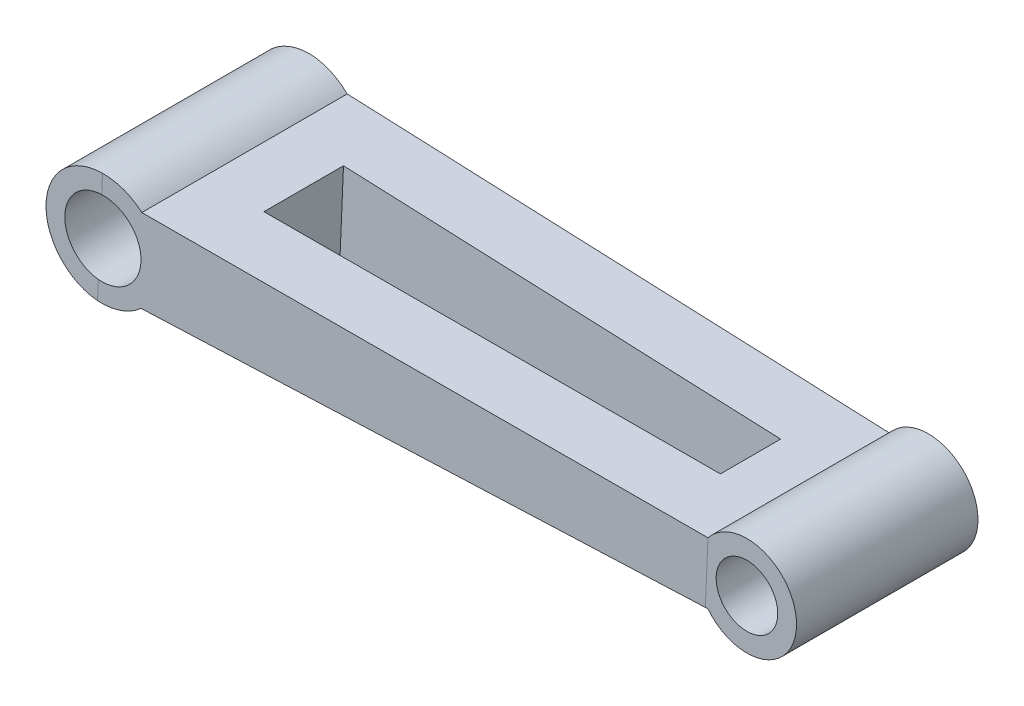
ISO-10303-21;
HEADER;
FILE_DESCRIPTION(('STEP AP214'),'2;1');
FILE_NAME('part.step','',(''),(''),'','','');
FILE_SCHEMA(('AUTOMOTIVE_DESIGN { 1 0 10303 214 1 1 1 1 }'));
ENDSEC;
DATA;
#1=APPLICATION_CONTEXT('core data for automotive mechanical design processes');
#2=APPLICATION_PROTOCOL_DEFINITION('international standard','automotive_design',2000,#1);
#3=PRODUCT_CONTEXT('',#1,'mechanical');
#4=PRODUCT('Part','Part','',(#3));
#5=PRODUCT_RELATED_PRODUCT_CATEGORY('part','',(#4));
#6=PRODUCT_DEFINITION_FORMATION('','',#4);
#7=PRODUCT_DEFINITION_CONTEXT('part definition',#1,'design');
#8=PRODUCT_DEFINITION('design','',#6,#7);
#9=PRODUCT_DEFINITION_SHAPE('','',#8);
#10=(LENGTH_UNIT() NAMED_UNIT(*) SI_UNIT(.MILLI.,.METRE.));
#11=(NAMED_UNIT(*) PLANE_ANGLE_UNIT() SI_UNIT($,.RADIAN.));
#12=(NAMED_UNIT(*) SI_UNIT($,.STERADIAN.) SOLID_ANGLE_UNIT());
#13=UNCERTAINTY_MEASURE_WITH_UNIT(LENGTH_MEASURE(1.E-05),#10,'distance_accuracy_value','');
#14=(GEOMETRIC_REPRESENTATION_CONTEXT(3) GLOBAL_UNCERTAINTY_ASSIGNED_CONTEXT((#13)) GLOBAL_UNIT_ASSIGNED_CONTEXT((#10,
#11,#12)) REPRESENTATION_CONTEXT('',''));
#15=CARTESIAN_POINT('',(0.,0.,0.));
#16=DIRECTION('',(0.,0.,1.));
#17=DIRECTION('',(1.,0.,0.));
#18=AXIS2_PLACEMENT_3D('',#15,#16,#17);
#19=CARTESIAN_POINT('',(184.500000000001,1.71965175207314E-11,121.));
#20=DIRECTION('',(0.,0.,-1.));
#21=DIRECTION('',(-1.,0.,0.));
#22=AXIS2_PLACEMENT_3D('',#19,#20,#21);
#23=CYLINDRICAL_SURFACE('',#22,29.);
#24=DIRECTION('',(0.,0.,-1.));
#25=VECTOR('',#24,1.);
#26=CARTESIAN_POINT('',(161.762365998198,-17.9999999999839,121.));
#27=LINE('',#26,#25);
#28=CARTESIAN_POINT('',(161.762365998198,-17.9999999999839,113.5));
#29=VERTEX_POINT('',#28);
#30=CARTESIAN_POINT('',(161.762365998198,-17.9999999999839,7.50000000000001));
#31=VERTEX_POINT('',#30);
#32=EDGE_CURVE('E213',#29,#31,#27,.T.);
#33=ORIENTED_EDGE('',*,*,#32,.T.);
#34=CARTESIAN_POINT('',(184.500000000001,1.71965175207314E-11,7.50000000000001));
#35=DIRECTION('',(0.,0.,1.));
#36=DIRECTION('',(1.,0.,0.));
#37=AXIS2_PLACEMENT_3D('',#34,#35,#36);
#38=CIRCLE('',#37,29.);
#39=CARTESIAN_POINT('',(161.762365998197,18.0000000000167,7.50000000000001));
#40=VERTEX_POINT('',#39);
#41=EDGE_CURVE('E233',#31,#40,#38,.T.);
#42=ORIENTED_EDGE('',*,*,#41,.T.);
#43=DIRECTION('',(0.,0.,-1.));
#44=VECTOR('',#43,1.);
#45=CARTESIAN_POINT('',(161.762365998196,18.0000000000161,121.));
#46=LINE('',#45,#44);
#47=CARTESIAN_POINT('',(161.762365998197,18.0000000000167,113.5));
#48=VERTEX_POINT('',#47);
#49=EDGE_CURVE('E206',#48,#40,#46,.T.);
#50=ORIENTED_EDGE('',*,*,#49,.F.);
#51=CARTESIAN_POINT('',(184.500000000001,1.71965175207314E-11,113.5));
#52=DIRECTION('',(0.,0.,-1.));
#53=DIRECTION('',(-1.,0.,0.));
#54=AXIS2_PLACEMENT_3D('',#51,#52,#53);
#55=CIRCLE('',#54,29.);
#56=EDGE_CURVE('E230',#48,#29,#55,.T.);
#57=ORIENTED_EDGE('',*,*,#56,.T.);
#58=EDGE_LOOP('',(#33,#42,#50,#57));
#59=FACE_BOUND('',#58,.T.);
#60=ADVANCED_FACE('F41',(#59),#23,.T.);
#61=CARTESIAN_POINT('',(0.432959275254487,-21.2820626529773,121.));
#62=DIRECTION('',(0.0203396501141064,-0.999793127918589,0.));
#63=DIRECTION('',(0.999793127918589,0.0203396501141064,0.));
#64=AXIS2_PLACEMENT_3D('',#61,#62,#63);
#65=PLANE('',#64);
#66=DIRECTION('',(0.,0.,-1.));
#67=VECTOR('',#66,1.);
#68=CARTESIAN_POINT('',(-129.48390804461,-23.9250730432448,121.));
#69=LINE('',#68,#67);
#70=CARTESIAN_POINT('',(-129.48390804461,-23.9250730432448,83.7488496268489));
#71=VERTEX_POINT('',#70);
#72=CARTESIAN_POINT('',(-129.483908044609,-23.9250730432447,37.2511503731511));
#73=VERTEX_POINT('',#72);
#74=EDGE_CURVE('E155',#71,#73,#69,.T.);
#75=ORIENTED_EDGE('',*,*,#74,.F.);
#76=DIRECTION('',(0.99956006873134,0.0203349087909345,-0.0215907499235799));
#77=VECTOR('',#76,1.);
#78=CARTESIAN_POINT('',(-0.43152927830131,-21.2996496859504,80.961285653307));
#79=LINE('',#78,#77);
#80=CARTESIAN_POINT('',(131.991309330689,-18.6056581698945,78.1009188959534));
#81=VERTEX_POINT('',#80);
#82=EDGE_CURVE('E153',#71,#81,#79,.T.);
#83=ORIENTED_EDGE('',*,*,#82,.T.);
#84=DIRECTION('',(0.,0.,-1.));
#85=VECTOR('',#84,1.);
#86=CARTESIAN_POINT('',(131.991309330689,-18.6056581698945,121.));
#87=LINE('',#86,#85);
#88=CARTESIAN_POINT('',(131.991309330689,-18.6056581698945,42.8990811040466));
#89=VERTEX_POINT('',#88);
#90=EDGE_CURVE('E138',#81,#89,#87,.T.);
#91=ORIENTED_EDGE('',*,*,#90,.T.);
#92=DIRECTION('',(0.99956006873134,0.0203349087909345,0.0215907499235799));
#93=VECTOR('',#92,1.);
#94=CARTESIAN_POINT('',(2.17980215048523,-21.2465251283691,40.0951197650467));
#95=LINE('',#94,#93);
#96=EDGE_CURVE('E133',#73,#89,#95,.T.);
#97=ORIENTED_EDGE('',*,*,#96,.F.);
#98=EDGE_LOOP('',(#75,#83,#91,#97));
#99=FACE_BOUND('',#98,.T.);
#100=DIRECTION('',(-0.999793127918589,-0.0203396501141064,0.));
#101=VECTOR('',#100,1.);
#102=CARTESIAN_POINT('',(0.432959275254487,-21.2820626529773,7.50000000000001));
#103=LINE('',#102,#101);
#104=CARTESIAN_POINT('',(160.201479312419,-18.0317544581513,7.5));
#105=VERTEX_POINT('',#104);
#106=EDGE_CURVE('E193',#31,#105,#103,.T.);
#107=ORIENTED_EDGE('',*,*,#106,.F.);
#108=ORIENTED_EDGE('',*,*,#32,.F.);
#109=DIRECTION('',(0.999793127918589,0.0203396501141064,0.));
#110=VECTOR('',#109,1.);
#111=CARTESIAN_POINT('',(0.432959275254487,-21.2820626529773,113.5));
#112=LINE('',#111,#110);
#113=CARTESIAN_POINT('',(160.201479312419,-18.0317544581513,113.5));
#114=VERTEX_POINT('',#113);
#115=EDGE_CURVE('E188',#114,#29,#112,.T.);
#116=ORIENTED_EDGE('',*,*,#115,.F.);
#117=DIRECTION('',(-0.99956006873134,-0.0203349087909345,0.0215907499235799));
#118=VECTOR('',#117,1.);
#119=CARTESIAN_POINT('',(0.345577659523577,-21.2838403322199,116.952927847325));
#120=LINE('',#119,#118);
#121=CARTESIAN_POINT('',(-162.5,-24.5967477524977,120.470433451435));
#122=VERTEX_POINT('',#121);
#123=EDGE_CURVE('E180',#114,#122,#120,.T.);
#124=ORIENTED_EDGE('',*,*,#123,.T.);
#125=DIRECTION('',(0.,0.,-1.));
#126=VECTOR('',#125,1.);
#127=CARTESIAN_POINT('',(-162.5,-24.5967477524977,121.));
#128=LINE('',#127,#126);
#129=CARTESIAN_POINT('',(-162.5,-24.5967477524977,0.529566548564874));
#130=VERTEX_POINT('',#129);
#131=EDGE_CURVE('E216',#122,#130,#128,.T.);
#132=ORIENTED_EDGE('',*,*,#131,.T.);
#133=DIRECTION('',(-0.99956006873134,-0.0203349087909345,-0.0215907499235799));
#134=VECTOR('',#133,1.);
#135=CARTESIAN_POINT('',(2.95690908831012,-21.2307157746386,4.10347757102926));
#136=LINE('',#135,#134);
#137=EDGE_CURVE('E168',#105,#130,#136,.T.);
#138=ORIENTED_EDGE('',*,*,#137,.F.);
#139=EDGE_LOOP('',(#107,#108,#116,#124,#132,#138));
#140=FACE_BOUND('',#139,.T.);
#141=ADVANCED_FACE('F151',(#99,#140),#65,.T.);
#142=CARTESIAN_POINT('',(0.,0.,121.));
#143=DIRECTION('',(0.,0.,1.));
#144=DIRECTION('',(1.,0.,0.));
#145=AXIS2_PLACEMENT_3D('',#142,#143,#144);
#146=PLANE('',#145);
#147=CARTESIAN_POINT('',(-184.5,0.,121.));
#148=DIRECTION('',(0.,0.,1.));
#149=DIRECTION('',(1.,0.,0.));
#150=AXIS2_PLACEMENT_3D('',#147,#148,#149);
#151=CIRCLE('',#150,33.);
#152=CARTESIAN_POINT('',(-184.5,33.,121.));
#153=VERTEX_POINT('',#152);
#154=CARTESIAN_POINT('',(-187.353748319103,-32.8763763290788,121.));
#155=VERTEX_POINT('',#154);
#156=EDGE_CURVE('E202',#153,#155,#151,.T.);
#157=ORIENTED_EDGE('',*,*,#156,.T.);
#158=DIRECTION('',(0.0432791626888545,0.999063018070908,0.));
#159=VECTOR('',#158,1.);
#160=CARTESIAN_POINT('',(-185.581289806749,8.03933554568197,121.));
#161=LINE('',#160,#159);
#162=CARTESIAN_POINT('',(-186.877007246941,-21.8712102213844,121.));
#163=VERTEX_POINT('',#162);
#164=EDGE_CURVE('E229',#155,#163,#161,.T.);
#165=ORIENTED_EDGE('',*,*,#164,.T.);
#166=CARTESIAN_POINT('',(-184.5,0.,121.));
#167=DIRECTION('',(0.,0.,1.));
#168=DIRECTION('',(1.,0.,0.));
#169=AXIS2_PLACEMENT_3D('',#166,#167,#168);
#170=CIRCLE('',#169,22.);
#171=CARTESIAN_POINT('',(-184.976741072162,21.9948338923056,121.));
#172=VERTEX_POINT('',#171);
#173=EDGE_CURVE('E199',#172,#163,#170,.T.);
#174=ORIENTED_EDGE('',*,*,#173,.F.);
#175=EDGE_CURVE('E226',#172,#153,#161,.T.);
#176=ORIENTED_EDGE('',*,*,#175,.T.);
#177=EDGE_LOOP('',(#157,#165,#174,#176));
#178=FACE_BOUND('',#177,.T.);
#179=ADVANCED_FACE('F267',(#178),#146,.T.);
#180=CARTESIAN_POINT('',(0.,0.,0.));
#181=DIRECTION('',(0.,0.,1.));
#182=DIRECTION('',(1.,0.,0.));
#183=AXIS2_PLACEMENT_3D('',#180,#181,#182);
#184=PLANE('',#183);
#185=CARTESIAN_POINT('',(-184.5,0.,0.));
#186=DIRECTION('',(0.,0.,1.));
#187=DIRECTION('',(1.,0.,0.));
#188=AXIS2_PLACEMENT_3D('',#185,#186,#187);
#189=CIRCLE('',#188,33.);
#190=CARTESIAN_POINT('',(-184.5,33.,0.));
#191=VERTEX_POINT('',#190);
#192=CARTESIAN_POINT('',(-187.353748319104,-32.8763763290788,0.));
#193=VERTEX_POINT('',#192);
#194=EDGE_CURVE('E203',#191,#193,#189,.T.);
#195=ORIENTED_EDGE('',*,*,#194,.F.);
#196=DIRECTION('',(-0.0432791626888545,-0.999063018070908,0.));
#197=VECTOR('',#196,1.);
#198=CARTESIAN_POINT('',(-185.581289806749,8.03933554568198,0.));
#199=LINE('',#198,#197);
#200=CARTESIAN_POINT('',(-184.976741072162,21.9948338923056,0.));
#201=VERTEX_POINT('',#200);
#202=EDGE_CURVE('E225',#191,#201,#199,.T.);
#203=ORIENTED_EDGE('',*,*,#202,.T.);
#204=CARTESIAN_POINT('',(-184.5,0.,0.));
#205=DIRECTION('',(0.,0.,1.));
#206=DIRECTION('',(1.,0.,0.));
#207=AXIS2_PLACEMENT_3D('',#204,#205,#206);
#208=CIRCLE('',#207,22.);
#209=CARTESIAN_POINT('',(-186.877007246941,-21.8712102213844,0.));
#210=VERTEX_POINT('',#209);
#211=EDGE_CURVE('E198',#201,#210,#208,.T.);
#212=ORIENTED_EDGE('',*,*,#211,.T.);
#213=EDGE_CURVE('E222',#210,#193,#199,.T.);
#214=ORIENTED_EDGE('',*,*,#213,.T.);
#215=EDGE_LOOP('',(#195,#203,#212,#214));
#216=FACE_BOUND('',#215,.T.);
#217=ADVANCED_FACE('F270',(#216),#184,.F.);
#218=CARTESIAN_POINT('',(-184.5,0.,121.));
#219=DIRECTION('',(0.,0.,-1.));
#220=DIRECTION('',(-1.,0.,0.));
#221=AXIS2_PLACEMENT_3D('',#218,#219,#220);
#222=CYLINDRICAL_SURFACE('',#221,22.);
#223=CARTESIAN_POINT('',(-184.5,0.,0.0309059177303062));
#224=DIRECTION('',(-0.0216142453727142,0.000936323760325724,0.999765946456861));
#225=DIRECTION('',(-0.99882918383171,0.0432690330474831,-0.0216345165237416));
#226=AXIS2_PLACEMENT_3D('',#223,#224,#225);
#227=ELLIPSE('',#226,22.0051503834146,22.);
#228=EDGE_CURVE('E164',#210,#201,#227,.T.);
#229=ORIENTED_EDGE('',*,*,#228,.F.);
#230=ORIENTED_EDGE('',*,*,#211,.F.);
#231=EDGE_LOOP('',(#229,#230));
#232=FACE_BOUND('',#231,.T.);
#233=ORIENTED_EDGE('',*,*,#173,.T.);
#234=CARTESIAN_POINT('',(-184.5,0.,120.96909408227));
#235=DIRECTION('',(0.0216142453727142,-0.000936323760325724,0.999765946456861));
#236=DIRECTION('',(0.99882918383171,-0.0432690330474831,-0.0216345165237416));
#237=AXIS2_PLACEMENT_3D('',#234,#235,#236);
#238=ELLIPSE('',#237,22.0051503834146,22.);
#239=EDGE_CURVE('E177',#163,#172,#238,.T.);
#240=ORIENTED_EDGE('',*,*,#239,.T.);
#241=EDGE_LOOP('',(#233,#240));
#242=FACE_BOUND('',#241,.T.);
#243=ADVANCED_FACE('F43',(#232,#242),#222,.F.);
#244=CARTESIAN_POINT('',(-184.5,0.,121.));
#245=DIRECTION('',(0.,0.,-1.));
#246=DIRECTION('',(-1.,0.,0.));
#247=AXIS2_PLACEMENT_3D('',#244,#245,#246);
#248=CYLINDRICAL_SURFACE('',#247,33.);
#249=ORIENTED_EDGE('',*,*,#194,.T.);
#250=CARTESIAN_POINT('',(-184.5,0.,0.0309059177303062));
#251=DIRECTION('',(-0.0216142453727142,0.000936323760325724,0.999765946456861));
#252=DIRECTION('',(-0.99882918383171,0.0432690330474831,-0.0216345165237416));
#253=AXIS2_PLACEMENT_3D('',#250,#251,#252);
#254=ELLIPSE('',#253,33.0077255751218,33.);
#255=EDGE_CURVE('E170',#193,#130,#254,.T.);
#256=ORIENTED_EDGE('',*,*,#255,.T.);
#257=ORIENTED_EDGE('',*,*,#131,.F.);
#258=CARTESIAN_POINT('',(-184.5,0.,120.96909408227));
#259=DIRECTION('',(0.0216142453727142,-0.000936323760325724,0.999765946456861));
#260=DIRECTION('',(0.99882918383171,-0.0432690330474831,-0.0216345165237416));
#261=AXIS2_PLACEMENT_3D('',#258,#259,#260);
#262=ELLIPSE('',#261,33.0077255751218,33.);
#263=EDGE_CURVE('E183',#155,#122,#262,.T.);
#264=ORIENTED_EDGE('',*,*,#263,.F.);
#265=ORIENTED_EDGE('',*,*,#156,.F.);
#266=CARTESIAN_POINT('',(-162.025328376794,24.1637980340231,120.505837726582));
#267=VERTEX_POINT('',#266);
#268=EDGE_CURVE('E185',#267,#153,#262,.T.);
#269=ORIENTED_EDGE('',*,*,#268,.F.);
#270=DIRECTION('',(0.,0.,-1.));
#271=VECTOR('',#270,1.);
#272=CARTESIAN_POINT('',(-162.025328376794,24.1637980340231,121.));
#273=LINE('',#272,#271);
#274=CARTESIAN_POINT('',(-162.025328376794,24.1637980340231,0.494162273417906));
#275=VERTEX_POINT('',#274);
#276=EDGE_CURVE('E219',#267,#275,#273,.T.);
#277=ORIENTED_EDGE('',*,*,#276,.T.);
#278=EDGE_CURVE('E173',#275,#191,#254,.T.);
#279=ORIENTED_EDGE('',*,*,#278,.T.);
#280=EDGE_LOOP('',(#249,#256,#257,#264,#265,#269,#277,#279));
#281=FACE_BOUND('',#280,.T.);
#282=ADVANCED_FACE('F273',(#281),#248,.T.);
#283=CARTESIAN_POINT('',(0.40113344130945,21.0717598762491,121.));
#284=DIRECTION('',(-0.0190330935837219,-0.999818854267428,0.));
#285=DIRECTION('',(0.999818854267428,-0.0190330935837219,0.));
#286=AXIS2_PLACEMENT_3D('',#283,#284,#285);
#287=PLANE('',#286);
#288=DIRECTION('',(0.999584980755785,-0.0190286414408014,-0.0216281541601559));
#289=VECTOR('',#288,1.);
#290=CARTESIAN_POINT('',(-0.464001926839432,21.0882290619964,81.0016857589098));
#291=LINE('',#290,#289);
#292=CARTESIAN_POINT('',(-127.429240001834,23.505208145604,83.7488496268489));
#293=VERTEX_POINT('',#292);
#294=CARTESIAN_POINT('',(133.600281479603,18.5361087039751,78.1009188959534));
#295=VERTEX_POINT('',#294);
#296=EDGE_CURVE('E49',#293,#295,#291,.T.);
#297=ORIENTED_EDGE('',*,*,#296,.F.);
#298=DIRECTION('',(0.,0.,-1.));
#299=VECTOR('',#298,1.);
#300=CARTESIAN_POINT('',(-127.429240001833,23.505208145604,121.));
#301=LINE('',#300,#299);
#302=CARTESIAN_POINT('',(-127.429240001834,23.505208145604,37.2511503731511));
#303=VERTEX_POINT('',#302);
#304=EDGE_CURVE('E11',#293,#303,#301,.T.);
#305=ORIENTED_EDGE('',*,*,#304,.T.);
#306=DIRECTION('',(0.999584980755785,-0.0190286414408014,0.0216281541601558));
#307=VECTOR('',#306,1.);
#308=CARTESIAN_POINT('',(2.15191861841603,21.038430980741,40.0549152644276));
#309=LINE('',#308,#307);
#310=CARTESIAN_POINT('',(133.600281479603,18.536108703975,42.8990811040466));
#311=VERTEX_POINT('',#310);
#312=EDGE_CURVE('E236',#303,#311,#309,.T.);
#313=ORIENTED_EDGE('',*,*,#312,.T.);
#314=DIRECTION('',(0.,0.,-1.));
#315=VECTOR('',#314,1.);
#316=CARTESIAN_POINT('',(133.600281479603,18.5361087039751,121.));
#317=LINE('',#316,#315);
#318=EDGE_CURVE('E146',#295,#311,#317,.T.);
#319=ORIENTED_EDGE('',*,*,#318,.F.);
#320=EDGE_LOOP('',(#297,#305,#313,#319));
#321=FACE_BOUND('',#320,.T.);
#322=ORIENTED_EDGE('',*,*,#49,.T.);
#323=DIRECTION('',(-0.999584980755784,0.0190286414408013,-0.0216281541601558));
#324=VECTOR('',#323,1.);
#325=CARTESIAN_POINT('',(2.93039123284832,21.0236115541423,4.06333128055851));
#326=LINE('',#325,#324);
#327=EDGE_CURVE('E174',#40,#275,#326,.T.);
#328=ORIENTED_EDGE('',*,*,#327,.T.);
#329=ORIENTED_EDGE('',*,*,#276,.F.);
#330=DIRECTION('',(-0.999584980755784,0.0190286414408013,0.0216281541601558));
#331=VECTOR('',#330,1.);
#332=CARTESIAN_POINT('',(0.314470687592864,21.0734096353976,116.993269742779));
#333=LINE('',#332,#331);
#334=EDGE_CURVE('E186',#48,#267,#333,.T.);
#335=ORIENTED_EDGE('',*,*,#334,.F.);
#336=EDGE_LOOP('',(#322,#328,#329,#335));
#337=FACE_BOUND('',#336,.T.);
#338=ADVANCED_FACE('F245',(#321,#337),#287,.F.);
#339=CARTESIAN_POINT('',(6.23120674160176,145.851052470432,4.01778635807372));
#340=DIRECTION('',(-0.0216142453727142,0.000936323760325724,0.999765946456861));
#341=DIRECTION('',(0.999766384705644,0.,0.0216142548473485));
#342=AXIS2_PLACEMENT_3D('',#339,#340,#341);
#343=PLANE('',#342);
#344=DIRECTION('',(-0.0432791626888545,-0.999063018070908,0.));
#345=VECTOR('',#344,1.);
#346=CARTESIAN_POINT('',(166.999144683547,138.88662518658,7.50000000000001));
#347=LINE('',#346,#345);
#348=EDGE_CURVE('E161',#40,#105,#347,.T.);
#349=ORIENTED_EDGE('',*,*,#348,.T.);
#350=ORIENTED_EDGE('',*,*,#137,.T.);
#351=ORIENTED_EDGE('',*,*,#255,.F.);
#352=ORIENTED_EDGE('',*,*,#213,.F.);
#353=ORIENTED_EDGE('',*,*,#228,.T.);
#354=ORIENTED_EDGE('',*,*,#202,.F.);
#355=ORIENTED_EDGE('',*,*,#278,.F.);
#356=ORIENTED_EDGE('',*,*,#327,.F.);
#357=EDGE_LOOP('',(#349,#350,#351,#352,#353,#354,#355,#356));
#358=FACE_BOUND('',#357,.T.);
#359=ADVANCED_FACE('F278',(#358),#343,.F.);
#360=CARTESIAN_POINT('',(6.31806849210077,145.847289640898,7.50000000000001));
#361=DIRECTION('',(0.,0.,1.));
#362=DIRECTION('',(1.,0.,0.));
#363=AXIS2_PLACEMENT_3D('',#360,#361,#362);
#364=PLANE('',#363);
#365=CARTESIAN_POINT('',(184.500000000001,1.71965175207314E-11,7.50000000000001));
#366=DIRECTION('',(0.,0.,1.));
#367=DIRECTION('',(1.,0.,0.));
#368=AXIS2_PLACEMENT_3D('',#365,#366,#367);
#369=CIRCLE('',#368,17.9999999999938);
#370=CARTESIAN_POINT('',(202.499999999995,1.71965175207314E-11,7.50000000000001));
#371=VERTEX_POINT('',#370);
#372=EDGE_CURVE('E195',#371,#371,#369,.T.);
#373=ORIENTED_EDGE('',*,*,#372,.T.);
#374=EDGE_LOOP('',(#373));
#375=FACE_BOUND('',#374,.T.);
#376=ORIENTED_EDGE('',*,*,#106,.T.);
#377=ORIENTED_EDGE('',*,*,#348,.F.);
#378=ORIENTED_EDGE('',*,*,#41,.F.);
#379=EDGE_LOOP('',(#376,#377,#378));
#380=FACE_BOUND('',#379,.T.);
#381=ADVANCED_FACE('F282',(#375,#380),#364,.F.);
#382=CARTESIAN_POINT('',(8.84591830592406,145.73778381257,116.925579312995));
#383=DIRECTION('',(0.0216142453727142,-0.000936323760325724,0.999765946456861));
#384=DIRECTION('',(0.999766384705644,0.,-0.0216142548473485));
#385=AXIS2_PLACEMENT_3D('',#382,#383,#384);
#386=PLANE('',#385);
#387=ORIENTED_EDGE('',*,*,#334,.T.);
#388=ORIENTED_EDGE('',*,*,#268,.T.);
#389=ORIENTED_EDGE('',*,*,#175,.F.);
#390=ORIENTED_EDGE('',*,*,#239,.F.);
#391=ORIENTED_EDGE('',*,*,#164,.F.);
#392=ORIENTED_EDGE('',*,*,#263,.T.);
#393=ORIENTED_EDGE('',*,*,#123,.F.);
#394=DIRECTION('',(-0.0432791626888545,-0.999063018070908,0.));
#395=VECTOR('',#394,1.);
#396=CARTESIAN_POINT('',(166.999144683547,138.88662518658,113.5));
#397=LINE('',#396,#395);
#398=EDGE_CURVE('E160',#48,#114,#397,.T.);
#399=ORIENTED_EDGE('',*,*,#398,.F.);
#400=EDGE_LOOP('',(#387,#388,#389,#390,#391,#392,#393,#399));
#401=FACE_BOUND('',#400,.T.);
#402=ADVANCED_FACE('F287',(#401),#386,.T.);
#403=CARTESIAN_POINT('',(6.31806849210077,145.847289640898,113.5));
#404=DIRECTION('',(0.,0.,-1.));
#405=DIRECTION('',(-1.,0.,0.));
#406=AXIS2_PLACEMENT_3D('',#403,#404,#405);
#407=PLANE('',#406);
#408=CARTESIAN_POINT('',(184.500000000001,1.71965175207314E-11,113.5));
#409=DIRECTION('',(0.,0.,-1.));
#410=DIRECTION('',(-1.,0.,0.));
#411=AXIS2_PLACEMENT_3D('',#408,#409,#410);
#412=CIRCLE('',#411,17.9999999999938);
#413=CARTESIAN_POINT('',(166.500000000007,1.71965175207314E-11,113.5));
#414=VERTEX_POINT('',#413);
#415=EDGE_CURVE('E190',#414,#414,#412,.T.);
#416=ORIENTED_EDGE('',*,*,#415,.T.);
#417=EDGE_LOOP('',(#416));
#418=FACE_BOUND('',#417,.T.);
#419=ORIENTED_EDGE('',*,*,#115,.T.);
#420=ORIENTED_EDGE('',*,*,#56,.F.);
#421=ORIENTED_EDGE('',*,*,#398,.T.);
#422=EDGE_LOOP('',(#419,#420,#421));
#423=FACE_BOUND('',#422,.T.);
#424=ADVANCED_FACE('F258',(#418,#423),#407,.F.);
#425=CARTESIAN_POINT('',(184.500000000001,1.71965175207314E-11,121.));
#426=DIRECTION('',(0.,0.,-1.));
#427=DIRECTION('',(-1.,0.,0.));
#428=AXIS2_PLACEMENT_3D('',#425,#426,#427);
#429=CYLINDRICAL_SURFACE('',#428,17.9999999999938);
#430=ORIENTED_EDGE('',*,*,#372,.F.);
#431=EDGE_LOOP('',(#430));
#432=FACE_BOUND('',#431,.T.);
#433=ORIENTED_EDGE('',*,*,#415,.F.);
#434=EDGE_LOOP('',(#433));
#435=FACE_BOUND('',#434,.T.);
#436=ADVANCED_FACE('F251',(#432,#435),#429,.F.);
#437=CARTESIAN_POINT('',(-121.888818143126,151.401180240543,0.));
#438=DIRECTION('',(-0.999063018070908,0.0432791626888545,0.));
#439=DIRECTION('',(-0.0432791626888545,-0.999063018070908,0.));
#440=AXIS2_PLACEMENT_3D('',#437,#438,#439);
#441=PLANE('',#440);
#442=ORIENTED_EDGE('',*,*,#74,.T.);
#443=DIRECTION('',(-0.0432791626888545,-0.999063018070908,0.));
#444=VECTOR('',#443,1.);
#445=CARTESIAN_POINT('',(-121.888818143126,151.401180240543,37.2511503731511));
#446=LINE('',#445,#444);
#447=EDGE_CURVE('E56',#303,#73,#446,.T.);
#448=ORIENTED_EDGE('',*,*,#447,.F.);
#449=ORIENTED_EDGE('',*,*,#304,.F.);
#450=DIRECTION('',(-0.0432791626888545,-0.999063018070908,0.));
#451=VECTOR('',#450,1.);
#452=CARTESIAN_POINT('',(-121.888818143126,151.401180240543,83.7488496268489));
#453=LINE('',#452,#451);
#454=EDGE_CURVE('E139',#293,#71,#453,.T.);
#455=ORIENTED_EDGE('',*,*,#454,.T.);
#456=EDGE_LOOP('',(#442,#448,#449,#455));
#457=FACE_BOUND('',#456,.T.);
#458=ADVANCED_FACE('F248',(#457),#441,.F.);
#459=CARTESIAN_POINT('',(8.06780547250635,145.771491467942,80.9340052405481));
#460=DIRECTION('',(-0.0216142453727142,0.000936323760325726,-0.999765946456861));
#461=DIRECTION('',(-0.999766384705644,0.,0.0216142548473485));
#462=AXIS2_PLACEMENT_3D('',#459,#460,#461);
#463=PLANE('',#462);
#464=ORIENTED_EDGE('',*,*,#454,.F.);
#465=ORIENTED_EDGE('',*,*,#296,.T.);
#466=DIRECTION('',(-0.0432791626888545,-0.999063018070908,0.));
#467=VECTOR('',#466,1.);
#468=CARTESIAN_POINT('',(138.866629573381,140.105318778752,78.1009188959534));
#469=LINE('',#468,#467);
#470=EDGE_CURVE('E148',#295,#81,#469,.T.);
#471=ORIENTED_EDGE('',*,*,#470,.T.);
#472=ORIENTED_EDGE('',*,*,#82,.F.);
#473=EDGE_LOOP('',(#464,#465,#471,#472));
#474=FACE_BOUND('',#473,.T.);
#475=ADVANCED_FACE('F241',(#474),#463,.T.);
#476=CARTESIAN_POINT('',(138.866629573381,140.105318778752,0.));
#477=DIRECTION('',(-0.999063018070908,0.0432791626888545,0.));
#478=DIRECTION('',(-0.0432791626888545,-0.999063018070908,0.));
#479=AXIS2_PLACEMENT_3D('',#476,#477,#478);
#480=PLANE('',#479);
#481=ORIENTED_EDGE('',*,*,#470,.F.);
#482=ORIENTED_EDGE('',*,*,#318,.T.);
#483=DIRECTION('',(-0.0432791626888545,-0.999063018070908,0.));
#484=VECTOR('',#483,1.);
#485=CARTESIAN_POINT('',(138.866629573381,140.105318778752,42.8990811040466));
#486=LINE('',#485,#484);
#487=EDGE_CURVE('E61',#311,#89,#486,.T.);
#488=ORIENTED_EDGE('',*,*,#487,.T.);
#489=ORIENTED_EDGE('',*,*,#90,.F.);
#490=EDGE_LOOP('',(#481,#482,#488,#489));
#491=FACE_BOUND('',#490,.T.);
#492=ADVANCED_FACE('F143',(#491),#480,.T.);
#493=CARTESIAN_POINT('',(5.45309390818405,145.884760125804,40.0093604305207));
#494=DIRECTION('',(0.0216142453727142,-0.000936323760325724,-0.999765946456861));
#495=DIRECTION('',(-0.999766384705644,0.,-0.0216142548473485));
#496=AXIS2_PLACEMENT_3D('',#493,#494,#495);
#497=PLANE('',#496);
#498=ORIENTED_EDGE('',*,*,#96,.T.);
#499=ORIENTED_EDGE('',*,*,#487,.F.);
#500=ORIENTED_EDGE('',*,*,#312,.F.);
#501=ORIENTED_EDGE('',*,*,#447,.T.);
#502=EDGE_LOOP('',(#498,#499,#500,#501));
#503=FACE_BOUND('',#502,.T.);
#504=ADVANCED_FACE('F134',(#503),#497,.F.);
#505=CLOSED_SHELL('',(#60,#141,#179,#217,#243,#282,#338,#359,#381,#402,#424,#436,#458,#475,#492,#504));
#506=MANIFOLD_SOLID_BREP('B2',#505);
#507=ADVANCED_BREP_SHAPE_REPRESENTATION('',(#18,#506),#14);
#508=SHAPE_DEFINITION_REPRESENTATION(#9,#507);
ENDSEC;
END-ISO-10303-21;
